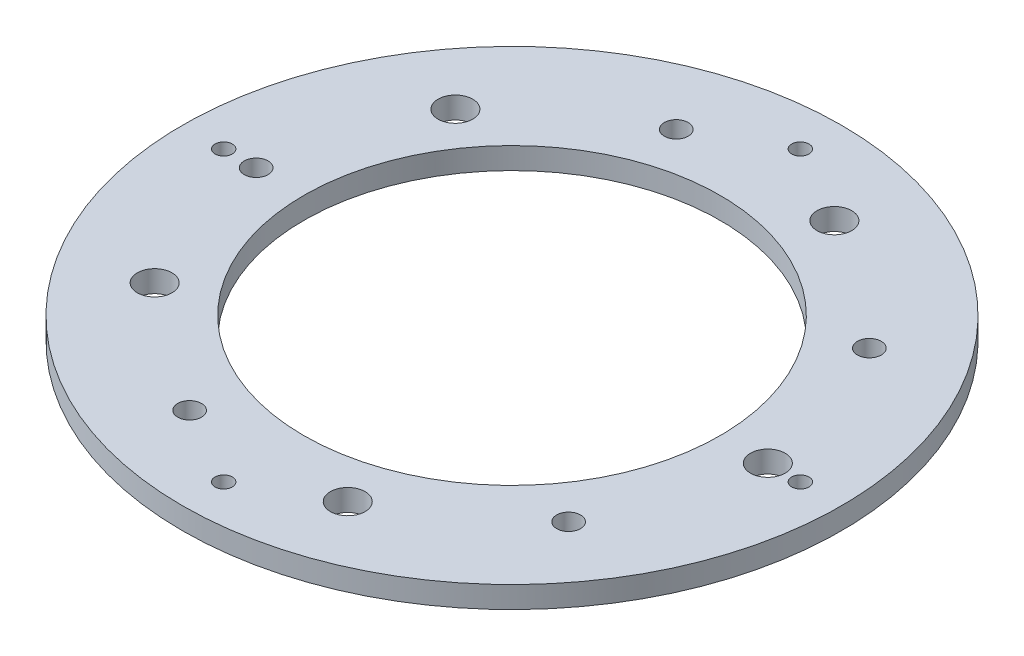
ISO-10303-21;
HEADER;
FILE_DESCRIPTION(('STEP AP214'),'2;1');
FILE_NAME('part.step','',(''),(''),'','','');
FILE_SCHEMA(('AUTOMOTIVE_DESIGN { 1 0 10303 214 1 1 1 1 }'));
ENDSEC;
DATA;
#1=APPLICATION_CONTEXT('core data for automotive mechanical design processes');
#2=APPLICATION_PROTOCOL_DEFINITION('international standard','automotive_design',2000,#1);
#3=PRODUCT_CONTEXT('',#1,'mechanical');
#4=PRODUCT('Part','Part','',(#3));
#5=PRODUCT_RELATED_PRODUCT_CATEGORY('part','',(#4));
#6=PRODUCT_DEFINITION_FORMATION('','',#4);
#7=PRODUCT_DEFINITION_CONTEXT('part definition',#1,'design');
#8=PRODUCT_DEFINITION('design','',#6,#7);
#9=PRODUCT_DEFINITION_SHAPE('','',#8);
#10=(LENGTH_UNIT() NAMED_UNIT(*) SI_UNIT(.MILLI.,.METRE.));
#11=(NAMED_UNIT(*) PLANE_ANGLE_UNIT() SI_UNIT($,.RADIAN.));
#12=(NAMED_UNIT(*) SI_UNIT($,.STERADIAN.) SOLID_ANGLE_UNIT());
#13=UNCERTAINTY_MEASURE_WITH_UNIT(LENGTH_MEASURE(1.E-05),#10,'distance_accuracy_value','');
#14=(GEOMETRIC_REPRESENTATION_CONTEXT(3) GLOBAL_UNCERTAINTY_ASSIGNED_CONTEXT((#13)) GLOBAL_UNIT_ASSIGNED_CONTEXT((#10,
#11,#12)) REPRESENTATION_CONTEXT('',''));
#15=CARTESIAN_POINT('',(0.,0.,0.));
#16=DIRECTION('',(0.,0.,1.));
#17=DIRECTION('',(1.,0.,0.));
#18=AXIS2_PLACEMENT_3D('',#15,#16,#17);
#19=CARTESIAN_POINT('',(0.,5.,0.));
#20=DIRECTION('',(0.,1.,0.));
#21=DIRECTION('',(0.,0.,1.));
#22=AXIS2_PLACEMENT_3D('',#19,#20,#21);
#23=PLANE('',#22);
#24=CARTESIAN_POINT('',(-18.2320026681219,5.,56.1123344614141));
#25=DIRECTION('',(0.,1.,0.));
#26=DIRECTION('',(0.,0.,1.));
#27=AXIS2_PLACEMENT_3D('',#24,#25,#26);
#28=CIRCLE('',#27,2.75000000000019);
#29=CARTESIAN_POINT('',(-18.2320026681219,5.,58.8623344614143));
#30=VERTEX_POINT('',#29);
#31=EDGE_CURVE('E125',#30,#30,#28,.T.);
#32=ORIENTED_EDGE('',*,*,#31,.F.);
#33=EDGE_LOOP('',(#32));
#34=FACE_BOUND('',#33,.T.);
#35=CARTESIAN_POINT('',(47.7320026681219,5.,34.6793298852559));
#36=DIRECTION('',(0.,1.,0.));
#37=DIRECTION('',(0.,0.,1.));
#38=AXIS2_PLACEMENT_3D('',#35,#36,#37);
#39=CIRCLE('',#38,2.75000000000016);
#40=CARTESIAN_POINT('',(47.7320026681219,5.,37.4293298852561));
#41=VERTEX_POINT('',#40);
#42=EDGE_CURVE('E113',#41,#41,#39,.T.);
#43=ORIENTED_EDGE('',*,*,#42,.F.);
#44=EDGE_LOOP('',(#43));
#45=FACE_BOUND('',#44,.T.);
#46=CARTESIAN_POINT('',(47.7320026681219,5.,-34.6793298852559));
#47=DIRECTION('',(0.,1.,0.));
#48=DIRECTION('',(0.,0.,1.));
#49=AXIS2_PLACEMENT_3D('',#46,#47,#48);
#50=CIRCLE('',#49,2.7500000000001);
#51=CARTESIAN_POINT('',(47.7320026681219,5.,-31.9293298852558));
#52=VERTEX_POINT('',#51);
#53=EDGE_CURVE('E101',#52,#52,#50,.T.);
#54=ORIENTED_EDGE('',*,*,#53,.F.);
#55=EDGE_LOOP('',(#54));
#56=FACE_BOUND('',#55,.T.);
#57=CARTESIAN_POINT('',(-18.2320026681219,5.,-56.1123344614141));
#58=DIRECTION('',(0.,1.,0.));
#59=DIRECTION('',(0.,0.,1.));
#60=AXIS2_PLACEMENT_3D('',#57,#58,#59);
#61=CIRCLE('',#60,2.75000000000005);
#62=CARTESIAN_POINT('',(-18.2320026681219,5.,-53.362334461414));
#63=VERTEX_POINT('',#62);
#64=EDGE_CURVE('E89',#63,#63,#61,.T.);
#65=ORIENTED_EDGE('',*,*,#64,.F.);
#66=EDGE_LOOP('',(#65));
#67=FACE_BOUND('',#66,.T.);
#68=CARTESIAN_POINT('',(0.,5.,66.5));
#69=DIRECTION('',(0.,1.,0.));
#70=DIRECTION('',(0.,0.,1.));
#71=AXIS2_PLACEMENT_3D('',#68,#69,#70);
#72=CIRCLE('',#71,2.);
#73=CARTESIAN_POINT('',(0.,5.,68.5));
#74=VERTEX_POINT('',#73);
#75=EDGE_CURVE('E77',#74,#74,#72,.T.);
#76=ORIENTED_EDGE('',*,*,#75,.F.);
#77=EDGE_LOOP('',(#76));
#78=FACE_BOUND('',#77,.T.);
#79=CARTESIAN_POINT('',(0.,5.,-66.5));
#80=DIRECTION('',(0.,1.,0.));
#81=DIRECTION('',(0.,0.,1.));
#82=AXIS2_PLACEMENT_3D('',#79,#80,#81);
#83=CIRCLE('',#82,2.);
#84=CARTESIAN_POINT('',(0.,5.,-64.5));
#85=VERTEX_POINT('',#84);
#86=EDGE_CURVE('E65',#85,#85,#83,.T.);
#87=ORIENTED_EDGE('',*,*,#86,.F.);
#88=EDGE_LOOP('',(#87));
#89=FACE_BOUND('',#88,.T.);
#90=CARTESIAN_POINT('',(-66.5,5.,0.));
#91=DIRECTION('',(0.,1.,0.));
#92=DIRECTION('',(0.,0.,1.));
#93=AXIS2_PLACEMENT_3D('',#90,#91,#92);
#94=CIRCLE('',#93,2.);
#95=CARTESIAN_POINT('',(-66.5,5.,2.));
#96=VERTEX_POINT('',#95);
#97=EDGE_CURVE('E53',#96,#96,#94,.T.);
#98=ORIENTED_EDGE('',*,*,#97,.F.);
#99=EDGE_LOOP('',(#98));
#100=FACE_BOUND('',#99,.T.);
#101=CARTESIAN_POINT('',(0.,5.,0.));
#102=DIRECTION('',(0.,1.,0.));
#103=DIRECTION('',(0.,0.,1.));
#104=AXIS2_PLACEMENT_3D('',#101,#102,#103);
#105=CIRCLE('',#104,76.);
#106=CARTESIAN_POINT('',(0.,5.,76.));
#107=VERTEX_POINT('',#106);
#108=EDGE_CURVE('E10',#107,#107,#105,.T.);
#109=ORIENTED_EDGE('',*,*,#108,.T.);
#110=EDGE_LOOP('',(#109));
#111=FACE_BOUND('',#110,.T.);
#112=CARTESIAN_POINT('',(0.,5.,0.));
#113=DIRECTION('',(0.,1.,0.));
#114=DIRECTION('',(0.,0.,1.));
#115=AXIS2_PLACEMENT_3D('',#112,#113,#114);
#116=CIRCLE('',#115,48.);
#117=CARTESIAN_POINT('',(0.,5.,48.));
#118=VERTEX_POINT('',#117);
#119=EDGE_CURVE('E48',#118,#118,#116,.T.);
#120=ORIENTED_EDGE('',*,*,#119,.F.);
#121=EDGE_LOOP('',(#120));
#122=FACE_BOUND('',#121,.T.);
#123=CARTESIAN_POINT('',(-59.,5.,0.));
#124=DIRECTION('',(0.,1.,0.));
#125=DIRECTION('',(0.,0.,1.));
#126=AXIS2_PLACEMENT_3D('',#123,#124,#125);
#127=CIRCLE('',#126,2.75);
#128=CARTESIAN_POINT('',(-59.,5.,2.75000000000001));
#129=VERTEX_POINT('',#128);
#130=EDGE_CURVE('E59',#129,#129,#127,.T.);
#131=ORIENTED_EDGE('',*,*,#130,.F.);
#132=EDGE_LOOP('',(#131));
#133=FACE_BOUND('',#132,.T.);
#134=CARTESIAN_POINT('',(66.5,5.,0.));
#135=DIRECTION('',(0.,1.,0.));
#136=DIRECTION('',(0.,0.,1.));
#137=AXIS2_PLACEMENT_3D('',#134,#135,#136);
#138=CIRCLE('',#137,2.);
#139=CARTESIAN_POINT('',(66.5,5.,1.99999999999998));
#140=VERTEX_POINT('',#139);
#141=EDGE_CURVE('E71',#140,#140,#138,.T.);
#142=ORIENTED_EDGE('',*,*,#141,.F.);
#143=EDGE_LOOP('',(#142));
#144=FACE_BOUND('',#143,.T.);
#145=CARTESIAN_POINT('',(-47.7320026681219,5.,-34.679329885256));
#146=DIRECTION('',(0.,1.,0.));
#147=DIRECTION('',(0.,0.,1.));
#148=AXIS2_PLACEMENT_3D('',#145,#146,#147);
#149=CIRCLE('',#148,4.);
#150=CARTESIAN_POINT('',(-47.7320026681219,5.,-30.679329885256));
#151=VERTEX_POINT('',#150);
#152=EDGE_CURVE('E83',#151,#151,#149,.T.);
#153=ORIENTED_EDGE('',*,*,#152,.F.);
#154=EDGE_LOOP('',(#153));
#155=FACE_BOUND('',#154,.T.);
#156=CARTESIAN_POINT('',(18.232002668122,5.,-56.1123344614141));
#157=DIRECTION('',(0.,1.,0.));
#158=DIRECTION('',(0.,0.,1.));
#159=AXIS2_PLACEMENT_3D('',#156,#157,#158);
#160=CIRCLE('',#159,4.00000000000016);
#161=CARTESIAN_POINT('',(18.232002668122,5.,-52.1123344614139));
#162=VERTEX_POINT('',#161);
#163=EDGE_CURVE('E95',#162,#162,#160,.T.);
#164=ORIENTED_EDGE('',*,*,#163,.F.);
#165=EDGE_LOOP('',(#164));
#166=FACE_BOUND('',#165,.T.);
#167=CARTESIAN_POINT('',(59.,5.,0.));
#168=DIRECTION('',(0.,1.,0.));
#169=DIRECTION('',(0.,0.,1.));
#170=AXIS2_PLACEMENT_3D('',#167,#168,#169);
#171=CIRCLE('',#170,4.00000000000027);
#172=CARTESIAN_POINT('',(59.,5.,4.00000000000034));
#173=VERTEX_POINT('',#172);
#174=EDGE_CURVE('E107',#173,#173,#171,.T.);
#175=ORIENTED_EDGE('',*,*,#174,.F.);
#176=EDGE_LOOP('',(#175));
#177=FACE_BOUND('',#176,.T.);
#178=CARTESIAN_POINT('',(18.2320026681218,5.,56.1123344614141));
#179=DIRECTION('',(0.,1.,0.));
#180=DIRECTION('',(0.,0.,1.));
#181=AXIS2_PLACEMENT_3D('',#178,#179,#180);
#182=CIRCLE('',#181,4.00000000000042);
#183=CARTESIAN_POINT('',(18.2320026681218,5.,60.1123344614145));
#184=VERTEX_POINT('',#183);
#185=EDGE_CURVE('E119',#184,#184,#182,.T.);
#186=ORIENTED_EDGE('',*,*,#185,.F.);
#187=EDGE_LOOP('',(#186));
#188=FACE_BOUND('',#187,.T.);
#189=CARTESIAN_POINT('',(-47.7320026681219,5.,34.6793298852559));
#190=DIRECTION('',(0.,1.,0.));
#191=DIRECTION('',(0.,0.,1.));
#192=AXIS2_PLACEMENT_3D('',#189,#190,#191);
#193=CIRCLE('',#192,4.00000000000054);
#194=CARTESIAN_POINT('',(-47.7320026681219,5.,38.6793298852564));
#195=VERTEX_POINT('',#194);
#196=EDGE_CURVE('E131',#195,#195,#193,.T.);
#197=ORIENTED_EDGE('',*,*,#196,.F.);
#198=EDGE_LOOP('',(#197));
#199=FACE_BOUND('',#198,.T.);
#200=ADVANCED_FACE('F37',(#34,#45,#56,#67,#78,#89,#100,#111,#122,#133,#144,#155,#166,#177,#188,
#199),#23,.T.);
#201=CARTESIAN_POINT('',(0.,0.,0.));
#202=DIRECTION('',(0.,1.,0.));
#203=DIRECTION('',(0.,0.,1.));
#204=AXIS2_PLACEMENT_3D('',#201,#202,#203);
#205=PLANE('',#204);
#206=CARTESIAN_POINT('',(0.,0.,0.));
#207=DIRECTION('',(0.,1.,0.));
#208=DIRECTION('',(0.,0.,1.));
#209=AXIS2_PLACEMENT_3D('',#206,#207,#208);
#210=CIRCLE('',#209,76.);
#211=CARTESIAN_POINT('',(0.,0.,76.));
#212=VERTEX_POINT('',#211);
#213=EDGE_CURVE('E41',#212,#212,#210,.T.);
#214=ORIENTED_EDGE('',*,*,#213,.F.);
#215=EDGE_LOOP('',(#214));
#216=FACE_BOUND('',#215,.T.);
#217=CARTESIAN_POINT('',(0.,0.,0.));
#218=DIRECTION('',(0.,1.,0.));
#219=DIRECTION('',(0.,0.,1.));
#220=AXIS2_PLACEMENT_3D('',#217,#218,#219);
#221=CIRCLE('',#220,48.);
#222=CARTESIAN_POINT('',(0.,0.,48.));
#223=VERTEX_POINT('',#222);
#224=EDGE_CURVE('E50',#223,#223,#221,.T.);
#225=ORIENTED_EDGE('',*,*,#224,.T.);
#226=EDGE_LOOP('',(#225));
#227=FACE_BOUND('',#226,.T.);
#228=CARTESIAN_POINT('',(-66.5,0.,0.));
#229=DIRECTION('',(0.,1.,0.));
#230=DIRECTION('',(0.,0.,1.));
#231=AXIS2_PLACEMENT_3D('',#228,#229,#230);
#232=CIRCLE('',#231,2.);
#233=CARTESIAN_POINT('',(-66.5,0.,2.));
#234=VERTEX_POINT('',#233);
#235=EDGE_CURVE('E56',#234,#234,#232,.T.);
#236=ORIENTED_EDGE('',*,*,#235,.T.);
#237=EDGE_LOOP('',(#236));
#238=FACE_BOUND('',#237,.T.);
#239=CARTESIAN_POINT('',(-59.,0.,0.));
#240=DIRECTION('',(0.,1.,0.));
#241=DIRECTION('',(0.,0.,1.));
#242=AXIS2_PLACEMENT_3D('',#239,#240,#241);
#243=CIRCLE('',#242,2.75);
#244=CARTESIAN_POINT('',(-59.,0.,2.75000000000001));
#245=VERTEX_POINT('',#244);
#246=EDGE_CURVE('E62',#245,#245,#243,.T.);
#247=ORIENTED_EDGE('',*,*,#246,.T.);
#248=EDGE_LOOP('',(#247));
#249=FACE_BOUND('',#248,.T.);
#250=CARTESIAN_POINT('',(0.,0.,-66.5));
#251=DIRECTION('',(0.,1.,0.));
#252=DIRECTION('',(0.,0.,1.));
#253=AXIS2_PLACEMENT_3D('',#250,#251,#252);
#254=CIRCLE('',#253,2.);
#255=CARTESIAN_POINT('',(0.,0.,-64.5));
#256=VERTEX_POINT('',#255);
#257=EDGE_CURVE('E68',#256,#256,#254,.T.);
#258=ORIENTED_EDGE('',*,*,#257,.T.);
#259=EDGE_LOOP('',(#258));
#260=FACE_BOUND('',#259,.T.);
#261=CARTESIAN_POINT('',(66.5,0.,0.));
#262=DIRECTION('',(0.,1.,0.));
#263=DIRECTION('',(0.,0.,1.));
#264=AXIS2_PLACEMENT_3D('',#261,#262,#263);
#265=CIRCLE('',#264,2.);
#266=CARTESIAN_POINT('',(66.5,0.,1.99999999999998));
#267=VERTEX_POINT('',#266);
#268=EDGE_CURVE('E74',#267,#267,#265,.T.);
#269=ORIENTED_EDGE('',*,*,#268,.T.);
#270=EDGE_LOOP('',(#269));
#271=FACE_BOUND('',#270,.T.);
#272=CARTESIAN_POINT('',(0.,0.,66.5));
#273=DIRECTION('',(0.,1.,0.));
#274=DIRECTION('',(0.,0.,1.));
#275=AXIS2_PLACEMENT_3D('',#272,#273,#274);
#276=CIRCLE('',#275,2.);
#277=CARTESIAN_POINT('',(0.,0.,68.5));
#278=VERTEX_POINT('',#277);
#279=EDGE_CURVE('E80',#278,#278,#276,.T.);
#280=ORIENTED_EDGE('',*,*,#279,.T.);
#281=EDGE_LOOP('',(#280));
#282=FACE_BOUND('',#281,.T.);
#283=CARTESIAN_POINT('',(-47.7320026681219,0.,-34.679329885256));
#284=DIRECTION('',(0.,1.,0.));
#285=DIRECTION('',(0.,0.,1.));
#286=AXIS2_PLACEMENT_3D('',#283,#284,#285);
#287=CIRCLE('',#286,4.);
#288=CARTESIAN_POINT('',(-47.7320026681219,0.,-30.679329885256));
#289=VERTEX_POINT('',#288);
#290=EDGE_CURVE('E86',#289,#289,#287,.T.);
#291=ORIENTED_EDGE('',*,*,#290,.T.);
#292=EDGE_LOOP('',(#291));
#293=FACE_BOUND('',#292,.T.);
#294=CARTESIAN_POINT('',(-18.2320026681219,0.,-56.1123344614141));
#295=DIRECTION('',(0.,1.,0.));
#296=DIRECTION('',(0.,0.,1.));
#297=AXIS2_PLACEMENT_3D('',#294,#295,#296);
#298=CIRCLE('',#297,2.75000000000005);
#299=CARTESIAN_POINT('',(-18.2320026681219,0.,-53.362334461414));
#300=VERTEX_POINT('',#299);
#301=EDGE_CURVE('E92',#300,#300,#298,.T.);
#302=ORIENTED_EDGE('',*,*,#301,.T.);
#303=EDGE_LOOP('',(#302));
#304=FACE_BOUND('',#303,.T.);
#305=CARTESIAN_POINT('',(18.232002668122,0.,-56.1123344614141));
#306=DIRECTION('',(0.,1.,0.));
#307=DIRECTION('',(0.,0.,1.));
#308=AXIS2_PLACEMENT_3D('',#305,#306,#307);
#309=CIRCLE('',#308,4.00000000000016);
#310=CARTESIAN_POINT('',(18.232002668122,0.,-52.1123344614139));
#311=VERTEX_POINT('',#310);
#312=EDGE_CURVE('E98',#311,#311,#309,.T.);
#313=ORIENTED_EDGE('',*,*,#312,.T.);
#314=EDGE_LOOP('',(#313));
#315=FACE_BOUND('',#314,.T.);
#316=CARTESIAN_POINT('',(47.7320026681219,0.,-34.6793298852559));
#317=DIRECTION('',(0.,1.,0.));
#318=DIRECTION('',(0.,0.,1.));
#319=AXIS2_PLACEMENT_3D('',#316,#317,#318);
#320=CIRCLE('',#319,2.7500000000001);
#321=CARTESIAN_POINT('',(47.7320026681219,0.,-31.9293298852558));
#322=VERTEX_POINT('',#321);
#323=EDGE_CURVE('E104',#322,#322,#320,.T.);
#324=ORIENTED_EDGE('',*,*,#323,.T.);
#325=EDGE_LOOP('',(#324));
#326=FACE_BOUND('',#325,.T.);
#327=CARTESIAN_POINT('',(59.,0.,0.));
#328=DIRECTION('',(0.,1.,0.));
#329=DIRECTION('',(0.,0.,1.));
#330=AXIS2_PLACEMENT_3D('',#327,#328,#329);
#331=CIRCLE('',#330,4.00000000000027);
#332=CARTESIAN_POINT('',(59.,0.,4.00000000000034));
#333=VERTEX_POINT('',#332);
#334=EDGE_CURVE('E110',#333,#333,#331,.T.);
#335=ORIENTED_EDGE('',*,*,#334,.T.);
#336=EDGE_LOOP('',(#335));
#337=FACE_BOUND('',#336,.T.);
#338=CARTESIAN_POINT('',(47.7320026681219,0.,34.6793298852559));
#339=DIRECTION('',(0.,1.,0.));
#340=DIRECTION('',(0.,0.,1.));
#341=AXIS2_PLACEMENT_3D('',#338,#339,#340);
#342=CIRCLE('',#341,2.75000000000016);
#343=CARTESIAN_POINT('',(47.7320026681219,0.,37.4293298852561));
#344=VERTEX_POINT('',#343);
#345=EDGE_CURVE('E116',#344,#344,#342,.T.);
#346=ORIENTED_EDGE('',*,*,#345,.T.);
#347=EDGE_LOOP('',(#346));
#348=FACE_BOUND('',#347,.T.);
#349=CARTESIAN_POINT('',(18.2320026681218,0.,56.1123344614141));
#350=DIRECTION('',(0.,1.,0.));
#351=DIRECTION('',(0.,0.,1.));
#352=AXIS2_PLACEMENT_3D('',#349,#350,#351);
#353=CIRCLE('',#352,4.00000000000042);
#354=CARTESIAN_POINT('',(18.2320026681218,0.,60.1123344614145));
#355=VERTEX_POINT('',#354);
#356=EDGE_CURVE('E122',#355,#355,#353,.T.);
#357=ORIENTED_EDGE('',*,*,#356,.T.);
#358=EDGE_LOOP('',(#357));
#359=FACE_BOUND('',#358,.T.);
#360=CARTESIAN_POINT('',(-18.2320026681219,0.,56.1123344614141));
#361=DIRECTION('',(0.,1.,0.));
#362=DIRECTION('',(0.,0.,1.));
#363=AXIS2_PLACEMENT_3D('',#360,#361,#362);
#364=CIRCLE('',#363,2.75000000000019);
#365=CARTESIAN_POINT('',(-18.2320026681219,0.,58.8623344614143));
#366=VERTEX_POINT('',#365);
#367=EDGE_CURVE('E128',#366,#366,#364,.T.);
#368=ORIENTED_EDGE('',*,*,#367,.T.);
#369=EDGE_LOOP('',(#368));
#370=FACE_BOUND('',#369,.T.);
#371=CARTESIAN_POINT('',(-47.7320026681219,0.,34.6793298852559));
#372=DIRECTION('',(0.,1.,0.));
#373=DIRECTION('',(0.,0.,1.));
#374=AXIS2_PLACEMENT_3D('',#371,#372,#373);
#375=CIRCLE('',#374,4.00000000000054);
#376=CARTESIAN_POINT('',(-47.7320026681219,0.,38.6793298852564));
#377=VERTEX_POINT('',#376);
#378=EDGE_CURVE('E134',#377,#377,#375,.T.);
#379=ORIENTED_EDGE('',*,*,#378,.T.);
#380=EDGE_LOOP('',(#379));
#381=FACE_BOUND('',#380,.T.);
#382=ADVANCED_FACE('F144',(#216,#227,#238,#249,#260,#271,#282,#293,#304,#315,#326,#337,#348,
#359,#370,#381),#205,.F.);
#383=CARTESIAN_POINT('',(0.,5.,0.));
#384=DIRECTION('',(0.,-1.,0.));
#385=DIRECTION('',(0.,0.,-1.));
#386=AXIS2_PLACEMENT_3D('',#383,#384,#385);
#387=CYLINDRICAL_SURFACE('',#386,76.);
#388=ORIENTED_EDGE('',*,*,#108,.F.);
#389=EDGE_LOOP('',(#388));
#390=FACE_BOUND('',#389,.T.);
#391=ORIENTED_EDGE('',*,*,#213,.T.);
#392=EDGE_LOOP('',(#391));
#393=FACE_BOUND('',#392,.T.);
#394=ADVANCED_FACE('F39',(#390,#393),#387,.T.);
#395=CARTESIAN_POINT('',(0.,5.,0.));
#396=DIRECTION('',(0.,-1.,0.));
#397=DIRECTION('',(0.,0.,-1.));
#398=AXIS2_PLACEMENT_3D('',#395,#396,#397);
#399=CYLINDRICAL_SURFACE('',#398,48.);
#400=ORIENTED_EDGE('',*,*,#119,.T.);
#401=EDGE_LOOP('',(#400));
#402=FACE_BOUND('',#401,.T.);
#403=ORIENTED_EDGE('',*,*,#224,.F.);
#404=EDGE_LOOP('',(#403));
#405=FACE_BOUND('',#404,.T.);
#406=ADVANCED_FACE('F154',(#402,#405),#399,.F.);
#407=CARTESIAN_POINT('',(-66.5,5.,0.));
#408=DIRECTION('',(0.,-1.,0.));
#409=DIRECTION('',(0.,0.,-1.));
#410=AXIS2_PLACEMENT_3D('',#407,#408,#409);
#411=CYLINDRICAL_SURFACE('',#410,2.);
#412=ORIENTED_EDGE('',*,*,#97,.T.);
#413=EDGE_LOOP('',(#412));
#414=FACE_BOUND('',#413,.T.);
#415=ORIENTED_EDGE('',*,*,#235,.F.);
#416=EDGE_LOOP('',(#415));
#417=FACE_BOUND('',#416,.T.);
#418=ADVANCED_FACE('F157',(#414,#417),#411,.F.);
#419=CARTESIAN_POINT('',(-59.,5.,0.));
#420=DIRECTION('',(0.,-1.,0.));
#421=DIRECTION('',(0.,0.,-1.));
#422=AXIS2_PLACEMENT_3D('',#419,#420,#421);
#423=CYLINDRICAL_SURFACE('',#422,2.75);
#424=ORIENTED_EDGE('',*,*,#130,.T.);
#425=EDGE_LOOP('',(#424));
#426=FACE_BOUND('',#425,.T.);
#427=ORIENTED_EDGE('',*,*,#246,.F.);
#428=EDGE_LOOP('',(#427));
#429=FACE_BOUND('',#428,.T.);
#430=ADVANCED_FACE('F161',(#426,#429),#423,.F.);
#431=CARTESIAN_POINT('',(0.,5.,-66.5));
#432=DIRECTION('',(0.,-1.,0.));
#433=DIRECTION('',(0.,0.,-1.));
#434=AXIS2_PLACEMENT_3D('',#431,#432,#433);
#435=CYLINDRICAL_SURFACE('',#434,2.);
#436=ORIENTED_EDGE('',*,*,#86,.T.);
#437=EDGE_LOOP('',(#436));
#438=FACE_BOUND('',#437,.T.);
#439=ORIENTED_EDGE('',*,*,#257,.F.);
#440=EDGE_LOOP('',(#439));
#441=FACE_BOUND('',#440,.T.);
#442=ADVANCED_FACE('F165',(#438,#441),#435,.F.);
#443=CARTESIAN_POINT('',(66.5,5.,0.));
#444=DIRECTION('',(0.,-1.,0.));
#445=DIRECTION('',(0.,0.,-1.));
#446=AXIS2_PLACEMENT_3D('',#443,#444,#445);
#447=CYLINDRICAL_SURFACE('',#446,2.);
#448=ORIENTED_EDGE('',*,*,#141,.T.);
#449=EDGE_LOOP('',(#448));
#450=FACE_BOUND('',#449,.T.);
#451=ORIENTED_EDGE('',*,*,#268,.F.);
#452=EDGE_LOOP('',(#451));
#453=FACE_BOUND('',#452,.T.);
#454=ADVANCED_FACE('F169',(#450,#453),#447,.F.);
#455=CARTESIAN_POINT('',(0.,5.,66.5));
#456=DIRECTION('',(0.,-1.,0.));
#457=DIRECTION('',(0.,0.,-1.));
#458=AXIS2_PLACEMENT_3D('',#455,#456,#457);
#459=CYLINDRICAL_SURFACE('',#458,2.);
#460=ORIENTED_EDGE('',*,*,#75,.T.);
#461=EDGE_LOOP('',(#460));
#462=FACE_BOUND('',#461,.T.);
#463=ORIENTED_EDGE('',*,*,#279,.F.);
#464=EDGE_LOOP('',(#463));
#465=FACE_BOUND('',#464,.T.);
#466=ADVANCED_FACE('F173',(#462,#465),#459,.F.);
#467=CARTESIAN_POINT('',(-47.7320026681219,5.,-34.679329885256));
#468=DIRECTION('',(0.,-1.,0.));
#469=DIRECTION('',(0.,0.,-1.));
#470=AXIS2_PLACEMENT_3D('',#467,#468,#469);
#471=CYLINDRICAL_SURFACE('',#470,4.);
#472=ORIENTED_EDGE('',*,*,#152,.T.);
#473=EDGE_LOOP('',(#472));
#474=FACE_BOUND('',#473,.T.);
#475=ORIENTED_EDGE('',*,*,#290,.F.);
#476=EDGE_LOOP('',(#475));
#477=FACE_BOUND('',#476,.T.);
#478=ADVANCED_FACE('F177',(#474,#477),#471,.F.);
#479=CARTESIAN_POINT('',(-18.2320026681219,5.,-56.1123344614141));
#480=DIRECTION('',(0.,-1.,0.));
#481=DIRECTION('',(0.,0.,-1.));
#482=AXIS2_PLACEMENT_3D('',#479,#480,#481);
#483=CYLINDRICAL_SURFACE('',#482,2.75000000000005);
#484=ORIENTED_EDGE('',*,*,#64,.T.);
#485=EDGE_LOOP('',(#484));
#486=FACE_BOUND('',#485,.T.);
#487=ORIENTED_EDGE('',*,*,#301,.F.);
#488=EDGE_LOOP('',(#487));
#489=FACE_BOUND('',#488,.T.);
#490=ADVANCED_FACE('F181',(#486,#489),#483,.F.);
#491=CARTESIAN_POINT('',(18.232002668122,5.,-56.1123344614141));
#492=DIRECTION('',(0.,-1.,0.));
#493=DIRECTION('',(0.,0.,-1.));
#494=AXIS2_PLACEMENT_3D('',#491,#492,#493);
#495=CYLINDRICAL_SURFACE('',#494,4.00000000000016);
#496=ORIENTED_EDGE('',*,*,#163,.T.);
#497=EDGE_LOOP('',(#496));
#498=FACE_BOUND('',#497,.T.);
#499=ORIENTED_EDGE('',*,*,#312,.F.);
#500=EDGE_LOOP('',(#499));
#501=FACE_BOUND('',#500,.T.);
#502=ADVANCED_FACE('F185',(#498,#501),#495,.F.);
#503=CARTESIAN_POINT('',(47.7320026681219,5.,-34.6793298852559));
#504=DIRECTION('',(0.,-1.,0.));
#505=DIRECTION('',(0.,0.,-1.));
#506=AXIS2_PLACEMENT_3D('',#503,#504,#505);
#507=CYLINDRICAL_SURFACE('',#506,2.7500000000001);
#508=ORIENTED_EDGE('',*,*,#53,.T.);
#509=EDGE_LOOP('',(#508));
#510=FACE_BOUND('',#509,.T.);
#511=ORIENTED_EDGE('',*,*,#323,.F.);
#512=EDGE_LOOP('',(#511));
#513=FACE_BOUND('',#512,.T.);
#514=ADVANCED_FACE('F189',(#510,#513),#507,.F.);
#515=CARTESIAN_POINT('',(59.,5.,0.));
#516=DIRECTION('',(0.,-1.,0.));
#517=DIRECTION('',(0.,0.,-1.));
#518=AXIS2_PLACEMENT_3D('',#515,#516,#517);
#519=CYLINDRICAL_SURFACE('',#518,4.00000000000027);
#520=ORIENTED_EDGE('',*,*,#174,.T.);
#521=EDGE_LOOP('',(#520));
#522=FACE_BOUND('',#521,.T.);
#523=ORIENTED_EDGE('',*,*,#334,.F.);
#524=EDGE_LOOP('',(#523));
#525=FACE_BOUND('',#524,.T.);
#526=ADVANCED_FACE('F193',(#522,#525),#519,.F.);
#527=CARTESIAN_POINT('',(47.7320026681219,5.,34.6793298852559));
#528=DIRECTION('',(0.,-1.,0.));
#529=DIRECTION('',(0.,0.,-1.));
#530=AXIS2_PLACEMENT_3D('',#527,#528,#529);
#531=CYLINDRICAL_SURFACE('',#530,2.75000000000016);
#532=ORIENTED_EDGE('',*,*,#42,.T.);
#533=EDGE_LOOP('',(#532));
#534=FACE_BOUND('',#533,.T.);
#535=ORIENTED_EDGE('',*,*,#345,.F.);
#536=EDGE_LOOP('',(#535));
#537=FACE_BOUND('',#536,.T.);
#538=ADVANCED_FACE('F197',(#534,#537),#531,.F.);
#539=CARTESIAN_POINT('',(18.2320026681218,5.,56.1123344614141));
#540=DIRECTION('',(0.,-1.,0.));
#541=DIRECTION('',(0.,0.,-1.));
#542=AXIS2_PLACEMENT_3D('',#539,#540,#541);
#543=CYLINDRICAL_SURFACE('',#542,4.00000000000042);
#544=ORIENTED_EDGE('',*,*,#185,.T.);
#545=EDGE_LOOP('',(#544));
#546=FACE_BOUND('',#545,.T.);
#547=ORIENTED_EDGE('',*,*,#356,.F.);
#548=EDGE_LOOP('',(#547));
#549=FACE_BOUND('',#548,.T.);
#550=ADVANCED_FACE('F201',(#546,#549),#543,.F.);
#551=CARTESIAN_POINT('',(-18.2320026681219,5.,56.1123344614141));
#552=DIRECTION('',(0.,-1.,0.));
#553=DIRECTION('',(0.,0.,-1.));
#554=AXIS2_PLACEMENT_3D('',#551,#552,#553);
#555=CYLINDRICAL_SURFACE('',#554,2.75000000000019);
#556=ORIENTED_EDGE('',*,*,#31,.T.);
#557=EDGE_LOOP('',(#556));
#558=FACE_BOUND('',#557,.T.);
#559=ORIENTED_EDGE('',*,*,#367,.F.);
#560=EDGE_LOOP('',(#559));
#561=FACE_BOUND('',#560,.T.);
#562=ADVANCED_FACE('F205',(#558,#561),#555,.F.);
#563=CARTESIAN_POINT('',(-47.7320026681219,5.,34.6793298852559));
#564=DIRECTION('',(0.,-1.,0.));
#565=DIRECTION('',(0.,0.,-1.));
#566=AXIS2_PLACEMENT_3D('',#563,#564,#565);
#567=CYLINDRICAL_SURFACE('',#566,4.00000000000054);
#568=ORIENTED_EDGE('',*,*,#196,.T.);
#569=EDGE_LOOP('',(#568));
#570=FACE_BOUND('',#569,.T.);
#571=ORIENTED_EDGE('',*,*,#378,.F.);
#572=EDGE_LOOP('',(#571));
#573=FACE_BOUND('',#572,.T.);
#574=ADVANCED_FACE('F140',(#570,#573),#567,.F.);
#575=CLOSED_SHELL('',(#200,#382,#394,#406,#418,#430,#442,#454,#466,#478,#490,#502,#514,#526,
#538,#550,#562,#574));
#576=MANIFOLD_SOLID_BREP('B2',#575);
#577=ADVANCED_BREP_SHAPE_REPRESENTATION('',(#18,#576),#14);
#578=SHAPE_DEFINITION_REPRESENTATION(#9,#577);
ENDSEC;
END-ISO-10303-21;
